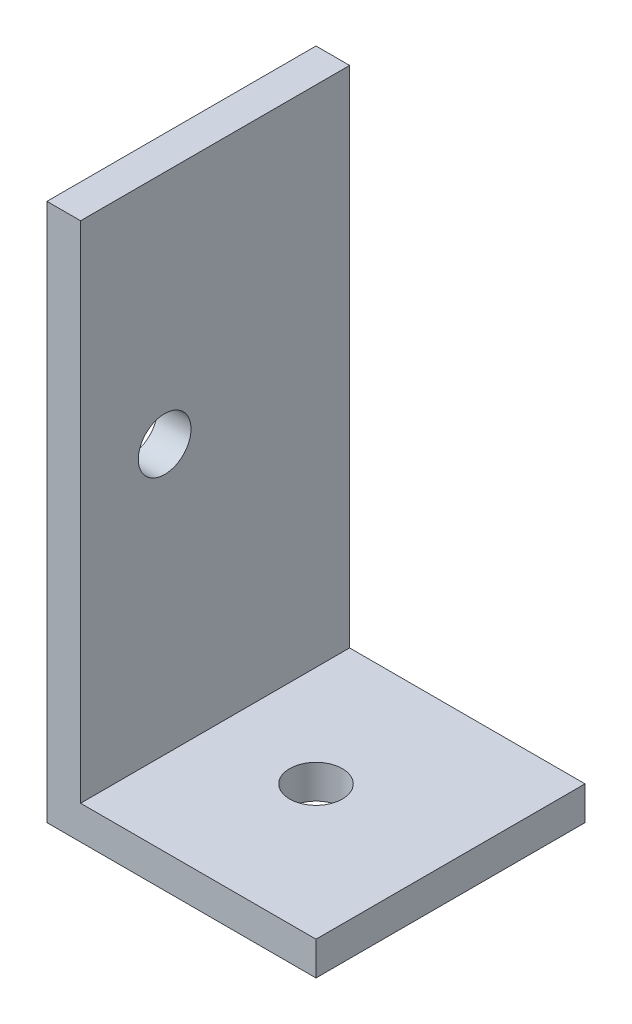
ISO-10303-21;
HEADER;
FILE_DESCRIPTION(('STEP AP214'),'2;1');
FILE_NAME('part.step','',(''),(''),'','','');
FILE_SCHEMA(('AUTOMOTIVE_DESIGN { 1 0 10303 214 1 1 1 1 }'));
ENDSEC;
DATA;
#1=APPLICATION_CONTEXT('core data for automotive mechanical design processes');
#2=APPLICATION_PROTOCOL_DEFINITION('international standard','automotive_design',2000,#1);
#3=PRODUCT_CONTEXT('',#1,'mechanical');
#4=PRODUCT('Part','Part','',(#3));
#5=PRODUCT_RELATED_PRODUCT_CATEGORY('part','',(#4));
#6=PRODUCT_DEFINITION_FORMATION('','',#4);
#7=PRODUCT_DEFINITION_CONTEXT('part definition',#1,'design');
#8=PRODUCT_DEFINITION('design','',#6,#7);
#9=PRODUCT_DEFINITION_SHAPE('','',#8);
#10=(LENGTH_UNIT() NAMED_UNIT(*) SI_UNIT(.MILLI.,.METRE.));
#11=(NAMED_UNIT(*) PLANE_ANGLE_UNIT() SI_UNIT($,.RADIAN.));
#12=(NAMED_UNIT(*) SI_UNIT($,.STERADIAN.) SOLID_ANGLE_UNIT());
#13=UNCERTAINTY_MEASURE_WITH_UNIT(LENGTH_MEASURE(1.E-05),#10,'distance_accuracy_value','');
#14=(GEOMETRIC_REPRESENTATION_CONTEXT(3) GLOBAL_UNCERTAINTY_ASSIGNED_CONTEXT((#13)) GLOBAL_UNIT_ASSIGNED_CONTEXT((#10,
#11,#12)) REPRESENTATION_CONTEXT('',''));
#15=CARTESIAN_POINT('',(0.,0.,0.));
#16=DIRECTION('',(0.,0.,1.));
#17=DIRECTION('',(1.,0.,0.));
#18=AXIS2_PLACEMENT_3D('',#15,#16,#17);
#19=CARTESIAN_POINT('',(25.4,0.,12.7));
#20=DIRECTION('',(0.,1.,0.));
#21=DIRECTION('',(-1.,0.,0.));
#22=AXIS2_PLACEMENT_3D('',#19,#20,#21);
#23=PLANE('',#22);
#24=CARTESIAN_POINT('',(12.7,0.,0.));
#25=DIRECTION('',(0.,1.,0.));
#26=DIRECTION('',(-1.,0.,0.));
#27=AXIS2_PLACEMENT_3D('',#24,#25,#26);
#28=CIRCLE('',#27,2.4892);
#29=CARTESIAN_POINT('',(10.2108,0.,0.));
#30=VERTEX_POINT('',#29);
#31=EDGE_CURVE('E139',#30,#30,#28,.T.);
#32=ORIENTED_EDGE('',*,*,#31,.T.);
#33=EDGE_LOOP('',(#32));
#34=FACE_BOUND('',#33,.T.);
#35=DIRECTION('',(1.,0.,0.));
#36=VECTOR('',#35,1.);
#37=CARTESIAN_POINT('',(25.4,0.,-12.7));
#38=LINE('',#37,#36);
#39=CARTESIAN_POINT('',(0.,0.,-12.7));
#40=VERTEX_POINT('',#39);
#41=CARTESIAN_POINT('',(25.4,0.,-12.7));
#42=VERTEX_POINT('',#41);
#43=EDGE_CURVE('E134',#40,#42,#38,.T.);
#44=ORIENTED_EDGE('',*,*,#43,.T.);
#45=DIRECTION('',(0.,0.,-1.));
#46=VECTOR('',#45,1.);
#47=CARTESIAN_POINT('',(25.4,0.,12.7));
#48=LINE('',#47,#46);
#49=CARTESIAN_POINT('',(25.4,0.,12.7));
#50=VERTEX_POINT('',#49);
#51=EDGE_CURVE('E11',#50,#42,#48,.T.);
#52=ORIENTED_EDGE('',*,*,#51,.F.);
#53=DIRECTION('',(1.,0.,0.));
#54=VECTOR('',#53,1.);
#55=CARTESIAN_POINT('',(25.4,0.,12.7));
#56=LINE('',#55,#54);
#57=CARTESIAN_POINT('',(0.,0.,12.7));
#58=VERTEX_POINT('',#57);
#59=EDGE_CURVE('E151',#58,#50,#56,.T.);
#60=ORIENTED_EDGE('',*,*,#59,.F.);
#61=DIRECTION('',(0.,0.,-1.));
#62=VECTOR('',#61,1.);
#63=CARTESIAN_POINT('',(0.,0.,12.7));
#64=LINE('',#63,#62);
#65=EDGE_CURVE('E130',#58,#40,#64,.T.);
#66=ORIENTED_EDGE('',*,*,#65,.T.);
#67=EDGE_LOOP('',(#44,#52,#60,#66));
#68=FACE_BOUND('',#67,.T.);
#69=ADVANCED_FACE('F45',(#34,#68),#23,.F.);
#70=CARTESIAN_POINT('',(25.4,3.175,12.7));
#71=DIRECTION('',(-1.,0.,0.));
#72=DIRECTION('',(0.,0.,1.));
#73=AXIS2_PLACEMENT_3D('',#70,#71,#72);
#74=PLANE('',#73);
#75=DIRECTION('',(0.,1.,0.));
#76=VECTOR('',#75,1.);
#77=CARTESIAN_POINT('',(25.4,3.175,-12.7));
#78=LINE('',#77,#76);
#79=CARTESIAN_POINT('',(25.4,3.175,-12.7));
#80=VERTEX_POINT('',#79);
#81=EDGE_CURVE('E138',#42,#80,#78,.T.);
#82=ORIENTED_EDGE('',*,*,#81,.T.);
#83=DIRECTION('',(0.,0.,-1.));
#84=VECTOR('',#83,1.);
#85=CARTESIAN_POINT('',(25.4,3.175,12.7));
#86=LINE('',#85,#84);
#87=CARTESIAN_POINT('',(25.4,3.175,12.7));
#88=VERTEX_POINT('',#87);
#89=EDGE_CURVE('E54',#88,#80,#86,.T.);
#90=ORIENTED_EDGE('',*,*,#89,.F.);
#91=DIRECTION('',(0.,1.,0.));
#92=VECTOR('',#91,1.);
#93=CARTESIAN_POINT('',(25.4,3.175,12.7));
#94=LINE('',#93,#92);
#95=EDGE_CURVE('E99',#50,#88,#94,.T.);
#96=ORIENTED_EDGE('',*,*,#95,.F.);
#97=ORIENTED_EDGE('',*,*,#51,.T.);
#98=EDGE_LOOP('',(#82,#90,#96,#97));
#99=FACE_BOUND('',#98,.T.);
#100=ADVANCED_FACE('F183',(#99),#74,.F.);
#101=CARTESIAN_POINT('',(3.175,3.175,12.7));
#102=DIRECTION('',(0.,-1.,0.));
#103=DIRECTION('',(1.,0.,0.));
#104=AXIS2_PLACEMENT_3D('',#101,#102,#103);
#105=PLANE('',#104);
#106=CARTESIAN_POINT('',(12.7,3.175,0.));
#107=DIRECTION('',(0.,1.,0.));
#108=DIRECTION('',(-1.,0.,0.));
#109=AXIS2_PLACEMENT_3D('',#106,#107,#108);
#110=CIRCLE('',#109,2.4892);
#111=CARTESIAN_POINT('',(10.2108,3.175,0.));
#112=VERTEX_POINT('',#111);
#113=EDGE_CURVE('E194',#112,#112,#110,.T.);
#114=ORIENTED_EDGE('',*,*,#113,.F.);
#115=EDGE_LOOP('',(#114));
#116=FACE_BOUND('',#115,.T.);
#117=DIRECTION('',(-1.,0.,0.));
#118=VECTOR('',#117,1.);
#119=CARTESIAN_POINT('',(3.175,3.175,-12.7));
#120=LINE('',#119,#118);
#121=CARTESIAN_POINT('',(3.175,3.175,-12.7));
#122=VERTEX_POINT('',#121);
#123=EDGE_CURVE('E142',#80,#122,#120,.T.);
#124=ORIENTED_EDGE('',*,*,#123,.T.);
#125=DIRECTION('',(0.,0.,-1.));
#126=VECTOR('',#125,1.);
#127=CARTESIAN_POINT('',(3.175,3.175,12.7));
#128=LINE('',#127,#126);
#129=CARTESIAN_POINT('',(3.175,3.175,12.7));
#130=VERTEX_POINT('',#129);
#131=EDGE_CURVE('E123',#130,#122,#128,.T.);
#132=ORIENTED_EDGE('',*,*,#131,.F.);
#133=DIRECTION('',(-1.,0.,0.));
#134=VECTOR('',#133,1.);
#135=CARTESIAN_POINT('',(3.175,3.175,12.7));
#136=LINE('',#135,#134);
#137=EDGE_CURVE('E112',#88,#130,#136,.T.);
#138=ORIENTED_EDGE('',*,*,#137,.F.);
#139=ORIENTED_EDGE('',*,*,#89,.T.);
#140=EDGE_LOOP('',(#124,#132,#138,#139));
#141=FACE_BOUND('',#140,.T.);
#142=ADVANCED_FACE('F161',(#116,#141),#105,.F.);
#143=CARTESIAN_POINT('',(3.175,50.8,12.7));
#144=DIRECTION('',(-1.,0.,0.));
#145=DIRECTION('',(0.,-1.,0.));
#146=AXIS2_PLACEMENT_3D('',#143,#144,#145);
#147=PLANE('',#146);
#148=CARTESIAN_POINT('',(3.175,28.575,4.7625));
#149=DIRECTION('',(1.,0.,0.));
#150=DIRECTION('',(0.,1.,0.));
#151=AXIS2_PLACEMENT_3D('',#148,#149,#150);
#152=CIRCLE('',#151,2.4892);
#153=CARTESIAN_POINT('',(3.175,31.0642,4.7625));
#154=VERTEX_POINT('',#153);
#155=EDGE_CURVE('E201',#154,#154,#152,.T.);
#156=ORIENTED_EDGE('',*,*,#155,.F.);
#157=EDGE_LOOP('',(#156));
#158=FACE_BOUND('',#157,.T.);
#159=DIRECTION('',(0.,1.,0.));
#160=VECTOR('',#159,1.);
#161=CARTESIAN_POINT('',(3.175,50.8,-12.7));
#162=LINE('',#161,#160);
#163=CARTESIAN_POINT('',(3.175,50.8,-12.7));
#164=VERTEX_POINT('',#163);
#165=EDGE_CURVE('E121',#122,#164,#162,.T.);
#166=ORIENTED_EDGE('',*,*,#165,.T.);
#167=DIRECTION('',(0.,0.,-1.));
#168=VECTOR('',#167,1.);
#169=CARTESIAN_POINT('',(3.175,50.8,12.7));
#170=LINE('',#169,#168);
#171=CARTESIAN_POINT('',(3.175,50.8,12.7));
#172=VERTEX_POINT('',#171);
#173=EDGE_CURVE('E118',#172,#164,#170,.T.);
#174=ORIENTED_EDGE('',*,*,#173,.F.);
#175=DIRECTION('',(0.,1.,0.));
#176=VECTOR('',#175,1.);
#177=CARTESIAN_POINT('',(3.175,50.8,12.7));
#178=LINE('',#177,#176);
#179=EDGE_CURVE('E106',#130,#172,#178,.T.);
#180=ORIENTED_EDGE('',*,*,#179,.F.);
#181=ORIENTED_EDGE('',*,*,#131,.T.);
#182=EDGE_LOOP('',(#166,#174,#180,#181));
#183=FACE_BOUND('',#182,.T.);
#184=ADVANCED_FACE('F119',(#158,#183),#147,.F.);
#185=CARTESIAN_POINT('',(0.,50.8,12.7));
#186=DIRECTION('',(0.,-1.,0.));
#187=DIRECTION('',(0.,0.,-1.));
#188=AXIS2_PLACEMENT_3D('',#185,#186,#187);
#189=PLANE('',#188);
#190=DIRECTION('',(-1.,0.,0.));
#191=VECTOR('',#190,1.);
#192=CARTESIAN_POINT('',(0.,50.8,-12.7));
#193=LINE('',#192,#191);
#194=CARTESIAN_POINT('',(0.,50.8,-12.7));
#195=VERTEX_POINT('',#194);
#196=EDGE_CURVE('E85',#164,#195,#193,.T.);
#197=ORIENTED_EDGE('',*,*,#196,.T.);
#198=DIRECTION('',(0.,0.,-1.));
#199=VECTOR('',#198,1.);
#200=CARTESIAN_POINT('',(0.,50.8,12.7));
#201=LINE('',#200,#199);
#202=CARTESIAN_POINT('',(0.,50.8,12.7));
#203=VERTEX_POINT('',#202);
#204=EDGE_CURVE('E124',#203,#195,#201,.T.);
#205=ORIENTED_EDGE('',*,*,#204,.F.);
#206=DIRECTION('',(-1.,0.,0.));
#207=VECTOR('',#206,1.);
#208=CARTESIAN_POINT('',(0.,50.8,12.7));
#209=LINE('',#208,#207);
#210=EDGE_CURVE('E110',#172,#203,#209,.T.);
#211=ORIENTED_EDGE('',*,*,#210,.F.);
#212=ORIENTED_EDGE('',*,*,#173,.T.);
#213=EDGE_LOOP('',(#197,#205,#211,#212));
#214=FACE_BOUND('',#213,.T.);
#215=ADVANCED_FACE('F126',(#214),#189,.F.);
#216=CARTESIAN_POINT('',(0.,0.,12.7));
#217=DIRECTION('',(1.,0.,0.));
#218=DIRECTION('',(0.,0.,-1.));
#219=AXIS2_PLACEMENT_3D('',#216,#217,#218);
#220=PLANE('',#219);
#221=CARTESIAN_POINT('',(0.,28.575,4.7625));
#222=DIRECTION('',(1.,0.,0.));
#223=DIRECTION('',(0.,1.,0.));
#224=AXIS2_PLACEMENT_3D('',#221,#222,#223);
#225=CIRCLE('',#224,2.4892);
#226=CARTESIAN_POINT('',(0.,31.0642,4.7625));
#227=VERTEX_POINT('',#226);
#228=EDGE_CURVE('E198',#227,#227,#225,.T.);
#229=ORIENTED_EDGE('',*,*,#228,.T.);
#230=EDGE_LOOP('',(#229));
#231=FACE_BOUND('',#230,.T.);
#232=DIRECTION('',(0.,-1.,0.));
#233=VECTOR('',#232,1.);
#234=CARTESIAN_POINT('',(0.,0.,-12.7));
#235=LINE('',#234,#233);
#236=EDGE_CURVE('E91',#195,#40,#235,.T.);
#237=ORIENTED_EDGE('',*,*,#236,.T.);
#238=ORIENTED_EDGE('',*,*,#65,.F.);
#239=DIRECTION('',(0.,-1.,0.));
#240=VECTOR('',#239,1.);
#241=CARTESIAN_POINT('',(0.,0.,12.7));
#242=LINE('',#241,#240);
#243=EDGE_CURVE('E62',#203,#58,#242,.T.);
#244=ORIENTED_EDGE('',*,*,#243,.F.);
#245=ORIENTED_EDGE('',*,*,#204,.T.);
#246=EDGE_LOOP('',(#237,#238,#244,#245));
#247=FACE_BOUND('',#246,.T.);
#248=ADVANCED_FACE('F168',(#231,#247),#220,.F.);
#249=CARTESIAN_POINT('',(0.,0.,12.7));
#250=DIRECTION('',(0.,0.,-1.));
#251=DIRECTION('',(-1.,0.,0.));
#252=AXIS2_PLACEMENT_3D('',#249,#250,#251);
#253=PLANE('',#252);
#254=ORIENTED_EDGE('',*,*,#59,.T.);
#255=ORIENTED_EDGE('',*,*,#95,.T.);
#256=ORIENTED_EDGE('',*,*,#137,.T.);
#257=ORIENTED_EDGE('',*,*,#179,.T.);
#258=ORIENTED_EDGE('',*,*,#210,.T.);
#259=ORIENTED_EDGE('',*,*,#243,.T.);
#260=EDGE_LOOP('',(#254,#255,#256,#257,#258,#259));
#261=FACE_BOUND('',#260,.T.);
#262=ADVANCED_FACE('F108',(#261),#253,.F.);
#263=CARTESIAN_POINT('',(0.,0.,-12.7));
#264=DIRECTION('',(0.,0.,-1.));
#265=DIRECTION('',(-1.,0.,0.));
#266=AXIS2_PLACEMENT_3D('',#263,#264,#265);
#267=PLANE('',#266);
#268=ORIENTED_EDGE('',*,*,#43,.F.);
#269=ORIENTED_EDGE('',*,*,#236,.F.);
#270=ORIENTED_EDGE('',*,*,#196,.F.);
#271=ORIENTED_EDGE('',*,*,#165,.F.);
#272=ORIENTED_EDGE('',*,*,#123,.F.);
#273=ORIENTED_EDGE('',*,*,#81,.F.);
#274=EDGE_LOOP('',(#268,#269,#270,#271,#272,#273));
#275=FACE_BOUND('',#274,.T.);
#276=ADVANCED_FACE('F164',(#275),#267,.T.);
#277=CARTESIAN_POINT('',(12.7,0.,0.));
#278=DIRECTION('',(0.,1.,0.));
#279=DIRECTION('',(-1.,0.,0.));
#280=AXIS2_PLACEMENT_3D('',#277,#278,#279);
#281=CYLINDRICAL_SURFACE('',#280,2.4892);
#282=ORIENTED_EDGE('',*,*,#31,.F.);
#283=EDGE_LOOP('',(#282));
#284=FACE_BOUND('',#283,.T.);
#285=ORIENTED_EDGE('',*,*,#113,.T.);
#286=EDGE_LOOP('',(#285));
#287=FACE_BOUND('',#286,.T.);
#288=ADVANCED_FACE('F215',(#284,#287),#281,.F.);
#289=CARTESIAN_POINT('',(0.,28.575,4.7625));
#290=DIRECTION('',(1.,0.,0.));
#291=DIRECTION('',(0.,1.,0.));
#292=AXIS2_PLACEMENT_3D('',#289,#290,#291);
#293=CYLINDRICAL_SURFACE('',#292,2.4892);
#294=ORIENTED_EDGE('',*,*,#228,.F.);
#295=EDGE_LOOP('',(#294));
#296=FACE_BOUND('',#295,.T.);
#297=ORIENTED_EDGE('',*,*,#155,.T.);
#298=EDGE_LOOP('',(#297));
#299=FACE_BOUND('',#298,.T.);
#300=ADVANCED_FACE('F213',(#296,#299),#293,.F.);
#301=CLOSED_SHELL('',(#69,#100,#142,#184,#215,#248,#262,#276,#288,#300));
#302=MANIFOLD_SOLID_BREP('B2',#301);
#303=ADVANCED_BREP_SHAPE_REPRESENTATION('',(#18,#302),#14);
#304=SHAPE_DEFINITION_REPRESENTATION(#9,#303);
ENDSEC;
END-ISO-10303-21;
